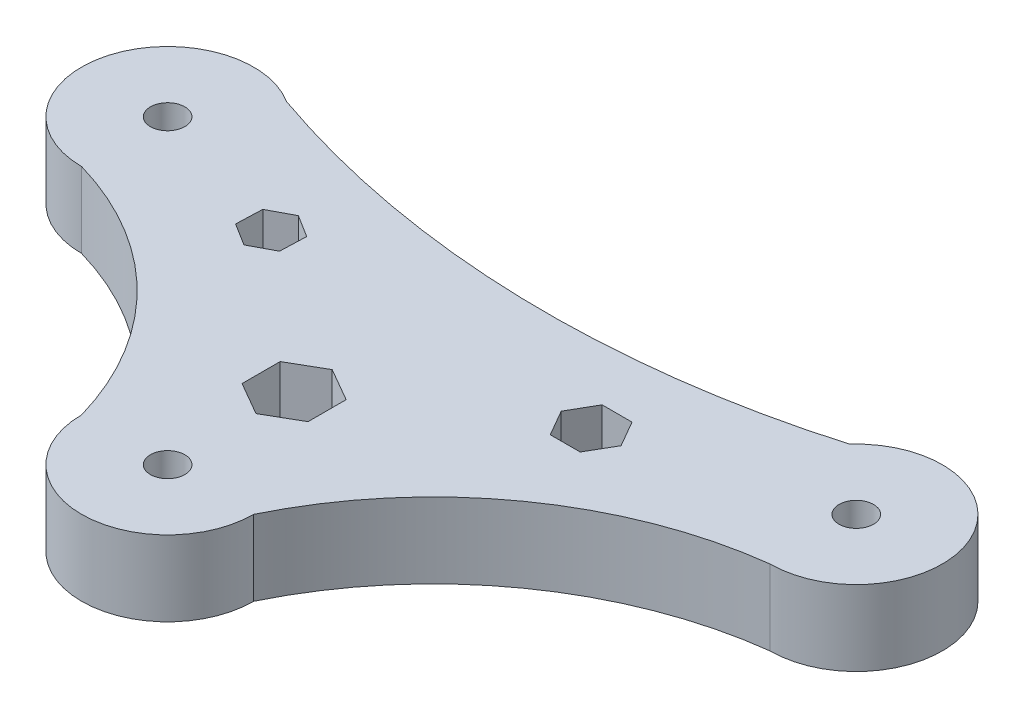
ISO-10303-21;
HEADER;
FILE_DESCRIPTION(('STEP AP214'),'2;1');
FILE_NAME('part.step','',(''),(''),'','','');
FILE_SCHEMA(('AUTOMOTIVE_DESIGN { 1 0 10303 214 1 1 1 1 }'));
ENDSEC;
DATA;
#1=APPLICATION_CONTEXT('core data for automotive mechanical design processes');
#2=APPLICATION_PROTOCOL_DEFINITION('international standard','automotive_design',2000,#1);
#3=PRODUCT_CONTEXT('',#1,'mechanical');
#4=PRODUCT('Part','Part','',(#3));
#5=PRODUCT_RELATED_PRODUCT_CATEGORY('part','',(#4));
#6=PRODUCT_DEFINITION_FORMATION('','',#4);
#7=PRODUCT_DEFINITION_CONTEXT('part definition',#1,'design');
#8=PRODUCT_DEFINITION('design','',#6,#7);
#9=PRODUCT_DEFINITION_SHAPE('','',#8);
#10=(LENGTH_UNIT() NAMED_UNIT(*) SI_UNIT(.MILLI.,.METRE.));
#11=(NAMED_UNIT(*) PLANE_ANGLE_UNIT() SI_UNIT($,.RADIAN.));
#12=(NAMED_UNIT(*) SI_UNIT($,.STERADIAN.) SOLID_ANGLE_UNIT());
#13=UNCERTAINTY_MEASURE_WITH_UNIT(LENGTH_MEASURE(1.E-05),#10,'distance_accuracy_value','');
#14=(GEOMETRIC_REPRESENTATION_CONTEXT(3) GLOBAL_UNCERTAINTY_ASSIGNED_CONTEXT((#13)) GLOBAL_UNIT_ASSIGNED_CONTEXT((#10,
#11,#12)) REPRESENTATION_CONTEXT('',''));
#15=CARTESIAN_POINT('',(0.,0.,0.));
#16=DIRECTION('',(0.,0.,1.));
#17=DIRECTION('',(1.,0.,0.));
#18=AXIS2_PLACEMENT_3D('',#15,#16,#17);
#19=CARTESIAN_POINT('',(5.36914479818591,7.,-117.947068273026));
#20=DIRECTION('',(0.,-1.,0.));
#21=DIRECTION('',(0.,0.,-1.));
#22=AXIS2_PLACEMENT_3D('',#19,#20,#21);
#23=CYLINDRICAL_SURFACE('',#22,88.131647090264);
#24=CARTESIAN_POINT('',(5.36914479818591,0.,-117.947068273026));
#25=DIRECTION('',(0.,1.,0.));
#26=DIRECTION('',(0.,0.,1.));
#27=AXIS2_PLACEMENT_3D('',#24,#25,#26);
#28=CIRCLE('',#27,88.131647090264);
#29=CARTESIAN_POINT('',(-23.7047539614299,0.,-34.7491378314677));
#30=VERTEX_POINT('',#29);
#31=CARTESIAN_POINT('',(30.0429345294128,0.,-33.3397912861026));
#32=VERTEX_POINT('',#31);
#33=EDGE_CURVE('E245',#30,#32,#28,.T.);
#34=ORIENTED_EDGE('',*,*,#33,.F.);
#35=DIRECTION('',(0.,-1.,0.));
#36=VECTOR('',#35,1.);
#37=CARTESIAN_POINT('',(-23.7047539614299,7.,-34.7491378314677));
#38=LINE('',#37,#36);
#39=CARTESIAN_POINT('',(-23.7047539614299,7.,-34.7491378314677));
#40=VERTEX_POINT('',#39);
#41=EDGE_CURVE('E11',#40,#30,#38,.T.);
#42=ORIENTED_EDGE('',*,*,#41,.F.);
#43=CARTESIAN_POINT('',(5.36914479818591,7.,-117.947068273026));
#44=DIRECTION('',(0.,1.,0.));
#45=DIRECTION('',(0.,0.,1.));
#46=AXIS2_PLACEMENT_3D('',#43,#44,#45);
#47=CIRCLE('',#46,88.131647090264);
#48=CARTESIAN_POINT('',(30.0429345294128,7.,-33.3397912861026));
#49=VERTEX_POINT('',#48);
#50=EDGE_CURVE('E346',#40,#49,#47,.T.);
#51=ORIENTED_EDGE('',*,*,#50,.T.);
#52=DIRECTION('',(0.,-1.,0.));
#53=VECTOR('',#52,1.);
#54=CARTESIAN_POINT('',(30.0429345294128,7.,-33.3397912861026));
#55=LINE('',#54,#53);
#56=EDGE_CURVE('E369',#49,#32,#55,.T.);
#57=ORIENTED_EDGE('',*,*,#56,.T.);
#58=EDGE_LOOP('',(#34,#42,#51,#57));
#59=FACE_BOUND('',#58,.T.);
#60=ADVANCED_FACE('F37',(#59),#23,.F.);
#61=CARTESIAN_POINT('',(-28.,7.,-28.));
#62=DIRECTION('',(0.,-1.,0.));
#63=DIRECTION('',(0.,0.,-1.));
#64=AXIS2_PLACEMENT_3D('',#61,#62,#63);
#65=CYLINDRICAL_SURFACE('',#64,8.);
#66=CARTESIAN_POINT('',(-28.,0.,-28.));
#67=DIRECTION('',(0.,1.,0.));
#68=DIRECTION('',(0.,0.,1.));
#69=AXIS2_PLACEMENT_3D('',#66,#67,#68);
#70=CIRCLE('',#69,8.);
#71=CARTESIAN_POINT('',(-28.,0.,-20.));
#72=VERTEX_POINT('',#71);
#73=EDGE_CURVE('E372',#30,#72,#70,.T.);
#74=ORIENTED_EDGE('',*,*,#73,.T.);
#75=DIRECTION('',(0.,-1.,0.));
#76=VECTOR('',#75,1.);
#77=CARTESIAN_POINT('',(-28.,7.,-20.));
#78=LINE('',#77,#76);
#79=CARTESIAN_POINT('',(-28.,7.,-20.));
#80=VERTEX_POINT('',#79);
#81=EDGE_CURVE('E44',#80,#72,#78,.T.);
#82=ORIENTED_EDGE('',*,*,#81,.F.);
#83=CARTESIAN_POINT('',(-28.,7.,-28.));
#84=DIRECTION('',(0.,1.,0.));
#85=DIRECTION('',(0.,0.,1.));
#86=AXIS2_PLACEMENT_3D('',#83,#84,#85);
#87=CIRCLE('',#86,8.);
#88=EDGE_CURVE('E349',#40,#80,#87,.T.);
#89=ORIENTED_EDGE('',*,*,#88,.F.);
#90=ORIENTED_EDGE('',*,*,#41,.T.);
#91=EDGE_LOOP('',(#74,#82,#89,#90));
#92=FACE_BOUND('',#91,.T.);
#93=ADVANCED_FACE('F430',(#92),#65,.T.);
#94=CARTESIAN_POINT('',(-36.0584719302514,7.,8.06085834931287));
#95=DIRECTION('',(0.,-1.,0.));
#96=DIRECTION('',(0.,0.,-1.));
#97=AXIS2_PLACEMENT_3D('',#94,#95,#96);
#98=CYLINDRICAL_SURFACE('',#97,29.1950465173606);
#99=CARTESIAN_POINT('',(-36.0584719302514,0.,8.06085834931287));
#100=DIRECTION('',(0.,1.,0.));
#101=DIRECTION('',(0.,0.,1.));
#102=AXIS2_PLACEMENT_3D('',#99,#100,#101);
#103=CIRCLE('',#102,29.1950465173606);
#104=CARTESIAN_POINT('',(-7.99999781608059,0.,-0.00591123554924541));
#105=VERTEX_POINT('',#104);
#106=EDGE_CURVE('E374',#72,#105,#103,.F.);
#107=ORIENTED_EDGE('',*,*,#106,.T.);
#108=DIRECTION('',(0.,-1.,0.));
#109=VECTOR('',#108,1.);
#110=CARTESIAN_POINT('',(-7.99999781608059,7.,-0.00591123554924541));
#111=LINE('',#110,#109);
#112=CARTESIAN_POINT('',(-7.99999781608059,7.,-0.00591123554924541));
#113=VERTEX_POINT('',#112);
#114=EDGE_CURVE('E398',#113,#105,#111,.T.);
#115=ORIENTED_EDGE('',*,*,#114,.F.);
#116=CARTESIAN_POINT('',(-36.0584719302514,7.,8.06085834931287));
#117=DIRECTION('',(0.,1.,0.));
#118=DIRECTION('',(0.,0.,1.));
#119=AXIS2_PLACEMENT_3D('',#116,#117,#118);
#120=CIRCLE('',#119,29.1950465173606);
#121=EDGE_CURVE('E352',#80,#113,#120,.F.);
#122=ORIENTED_EDGE('',*,*,#121,.F.);
#123=ORIENTED_EDGE('',*,*,#81,.T.);
#124=EDGE_LOOP('',(#107,#115,#122,#123));
#125=FACE_BOUND('',#124,.T.);
#126=ADVANCED_FACE('F405',(#125),#98,.F.);
#127=CARTESIAN_POINT('',(0.,7.,0.));
#128=DIRECTION('',(0.,-1.,0.));
#129=DIRECTION('',(0.,0.,-1.));
#130=AXIS2_PLACEMENT_3D('',#127,#128,#129);
#131=CYLINDRICAL_SURFACE('',#130,8.);
#132=CARTESIAN_POINT('',(0.,0.,0.));
#133=DIRECTION('',(0.,1.,0.));
#134=DIRECTION('',(0.,0.,1.));
#135=AXIS2_PLACEMENT_3D('',#132,#133,#134);
#136=CIRCLE('',#135,8.);
#137=CARTESIAN_POINT('',(8.,0.,0.));
#138=VERTEX_POINT('',#137);
#139=EDGE_CURVE('E376',#105,#138,#136,.T.);
#140=ORIENTED_EDGE('',*,*,#139,.T.);
#141=DIRECTION('',(0.,-1.,0.));
#142=VECTOR('',#141,1.);
#143=CARTESIAN_POINT('',(8.,7.,0.));
#144=LINE('',#143,#142);
#145=CARTESIAN_POINT('',(8.,7.,0.));
#146=VERTEX_POINT('',#145);
#147=EDGE_CURVE('E395',#146,#138,#144,.T.);
#148=ORIENTED_EDGE('',*,*,#147,.F.);
#149=CARTESIAN_POINT('',(0.,7.,0.));
#150=DIRECTION('',(0.,1.,0.));
#151=DIRECTION('',(0.,0.,1.));
#152=AXIS2_PLACEMENT_3D('',#149,#150,#151);
#153=CIRCLE('',#152,8.);
#154=EDGE_CURVE('E354',#113,#146,#153,.T.);
#155=ORIENTED_EDGE('',*,*,#154,.F.);
#156=ORIENTED_EDGE('',*,*,#114,.T.);
#157=EDGE_LOOP('',(#140,#148,#155,#156));
#158=FACE_BOUND('',#157,.T.);
#159=ADVANCED_FACE('F418',(#158),#131,.T.);
#160=CARTESIAN_POINT('',(40.3480725946694,7.,15.6873016325372));
#161=DIRECTION('',(0.,-1.,0.));
#162=DIRECTION('',(0.,0.,-1.));
#163=AXIS2_PLACEMENT_3D('',#160,#161,#162);
#164=CYLINDRICAL_SURFACE('',#163,35.9512062815729);
#165=CARTESIAN_POINT('',(40.3480725946694,0.,15.6873016325372));
#166=DIRECTION('',(0.,1.,0.));
#167=DIRECTION('',(0.,0.,1.));
#168=AXIS2_PLACEMENT_3D('',#165,#166,#167);
#169=CIRCLE('',#168,35.9512062815729);
#170=CARTESIAN_POINT('',(36.,0.,-20.));
#171=VERTEX_POINT('',#170);
#172=EDGE_CURVE('E378',#138,#171,#169,.F.);
#173=ORIENTED_EDGE('',*,*,#172,.T.);
#174=DIRECTION('',(0.,-1.,0.));
#175=VECTOR('',#174,1.);
#176=CARTESIAN_POINT('',(36.,7.,-20.));
#177=LINE('',#176,#175);
#178=CARTESIAN_POINT('',(36.,7.,-20.));
#179=VERTEX_POINT('',#178);
#180=EDGE_CURVE('E392',#179,#171,#177,.T.);
#181=ORIENTED_EDGE('',*,*,#180,.F.);
#182=CARTESIAN_POINT('',(40.3480725946694,7.,15.6873016325372));
#183=DIRECTION('',(0.,1.,0.));
#184=DIRECTION('',(0.,0.,1.));
#185=AXIS2_PLACEMENT_3D('',#182,#183,#184);
#186=CIRCLE('',#185,35.9512062815729);
#187=EDGE_CURVE('E356',#146,#179,#186,.F.);
#188=ORIENTED_EDGE('',*,*,#187,.F.);
#189=ORIENTED_EDGE('',*,*,#147,.T.);
#190=EDGE_LOOP('',(#173,#181,#188,#189));
#191=FACE_BOUND('',#190,.T.);
#192=ADVANCED_FACE('F422',(#191),#164,.F.);
#193=CARTESIAN_POINT('',(0.,7.,0.));
#194=DIRECTION('',(0.,-1.,0.));
#195=DIRECTION('',(0.,0.,-1.));
#196=AXIS2_PLACEMENT_3D('',#193,#194,#195);
#197=CYLINDRICAL_SURFACE('',#196,1.6);
#198=CARTESIAN_POINT('',(0.,7.,0.));
#199=DIRECTION('',(0.,1.,0.));
#200=DIRECTION('',(0.,0.,1.));
#201=AXIS2_PLACEMENT_3D('',#198,#199,#200);
#202=CIRCLE('',#201,1.6);
#203=CARTESIAN_POINT('',(0.,7.,1.6));
#204=VERTEX_POINT('',#203);
#205=EDGE_CURVE('E363',#204,#204,#202,.T.);
#206=ORIENTED_EDGE('',*,*,#205,.T.);
#207=EDGE_LOOP('',(#206));
#208=FACE_BOUND('',#207,.T.);
#209=CARTESIAN_POINT('',(0.,0.,0.));
#210=DIRECTION('',(0.,1.,0.));
#211=DIRECTION('',(0.,0.,1.));
#212=AXIS2_PLACEMENT_3D('',#209,#210,#211);
#213=CIRCLE('',#212,1.6);
#214=CARTESIAN_POINT('',(0.,0.,1.6));
#215=VERTEX_POINT('',#214);
#216=EDGE_CURVE('E386',#215,#215,#213,.T.);
#217=ORIENTED_EDGE('',*,*,#216,.F.);
#218=EDGE_LOOP('',(#217));
#219=FACE_BOUND('',#218,.T.);
#220=ADVANCED_FACE('F444',(#208,#219),#197,.F.);
#221=CARTESIAN_POINT('',(36.,7.,-28.));
#222=DIRECTION('',(0.,-1.,0.));
#223=DIRECTION('',(0.,0.,-1.));
#224=AXIS2_PLACEMENT_3D('',#221,#222,#223);
#225=CYLINDRICAL_SURFACE('',#224,1.6);
#226=CARTESIAN_POINT('',(36.,7.,-28.));
#227=DIRECTION('',(0.,1.,0.));
#228=DIRECTION('',(0.,0.,1.));
#229=AXIS2_PLACEMENT_3D('',#226,#227,#228);
#230=CIRCLE('',#229,1.6);
#231=CARTESIAN_POINT('',(36.,7.,-26.4));
#232=VERTEX_POINT('',#231);
#233=EDGE_CURVE('E360',#232,#232,#230,.T.);
#234=ORIENTED_EDGE('',*,*,#233,.T.);
#235=EDGE_LOOP('',(#234));
#236=FACE_BOUND('',#235,.T.);
#237=CARTESIAN_POINT('',(36.,0.,-28.));
#238=DIRECTION('',(0.,1.,0.));
#239=DIRECTION('',(0.,0.,1.));
#240=AXIS2_PLACEMENT_3D('',#237,#238,#239);
#241=CIRCLE('',#240,1.6);
#242=CARTESIAN_POINT('',(36.,0.,-26.4));
#243=VERTEX_POINT('',#242);
#244=EDGE_CURVE('E383',#243,#243,#241,.T.);
#245=ORIENTED_EDGE('',*,*,#244,.F.);
#246=EDGE_LOOP('',(#245));
#247=FACE_BOUND('',#246,.T.);
#248=ADVANCED_FACE('F436',(#236,#247),#225,.F.);
#249=CARTESIAN_POINT('',(36.,7.,-28.));
#250=DIRECTION('',(0.,-1.,0.));
#251=DIRECTION('',(0.,0.,-1.));
#252=AXIS2_PLACEMENT_3D('',#249,#250,#251);
#253=CYLINDRICAL_SURFACE('',#252,8.00000000000001);
#254=CARTESIAN_POINT('',(36.,0.,-28.));
#255=DIRECTION('',(0.,1.,0.));
#256=DIRECTION('',(0.,0.,1.));
#257=AXIS2_PLACEMENT_3D('',#254,#255,#256);
#258=CIRCLE('',#257,8.00000000000001);
#259=EDGE_CURVE('E380',#171,#32,#258,.T.);
#260=ORIENTED_EDGE('',*,*,#259,.T.);
#261=ORIENTED_EDGE('',*,*,#56,.F.);
#262=CARTESIAN_POINT('',(36.,7.,-28.));
#263=DIRECTION('',(0.,1.,0.));
#264=DIRECTION('',(0.,0.,1.));
#265=AXIS2_PLACEMENT_3D('',#262,#263,#264);
#266=CIRCLE('',#265,8.00000000000001);
#267=EDGE_CURVE('E358',#179,#49,#266,.T.);
#268=ORIENTED_EDGE('',*,*,#267,.F.);
#269=ORIENTED_EDGE('',*,*,#180,.T.);
#270=EDGE_LOOP('',(#260,#261,#268,#269));
#271=FACE_BOUND('',#270,.T.);
#272=ADVANCED_FACE('F433',(#271),#253,.T.);
#273=CARTESIAN_POINT('',(-28.,7.,-28.));
#274=DIRECTION('',(0.,-1.,0.));
#275=DIRECTION('',(0.,0.,-1.));
#276=AXIS2_PLACEMENT_3D('',#273,#274,#275);
#277=CYLINDRICAL_SURFACE('',#276,1.60000000000001);
#278=CARTESIAN_POINT('',(-28.,7.,-28.));
#279=DIRECTION('',(0.,1.,0.));
#280=DIRECTION('',(0.,0.,1.));
#281=AXIS2_PLACEMENT_3D('',#278,#279,#280);
#282=CIRCLE('',#281,1.60000000000001);
#283=CARTESIAN_POINT('',(-28.,7.,-26.4));
#284=VERTEX_POINT('',#283);
#285=EDGE_CURVE('E366',#284,#284,#282,.T.);
#286=ORIENTED_EDGE('',*,*,#285,.T.);
#287=EDGE_LOOP('',(#286));
#288=FACE_BOUND('',#287,.T.);
#289=CARTESIAN_POINT('',(-28.,0.,-28.));
#290=DIRECTION('',(0.,1.,0.));
#291=DIRECTION('',(0.,0.,1.));
#292=AXIS2_PLACEMENT_3D('',#289,#290,#291);
#293=CIRCLE('',#292,1.60000000000001);
#294=CARTESIAN_POINT('',(-28.,0.,-26.4));
#295=VERTEX_POINT('',#294);
#296=EDGE_CURVE('E350',#295,#295,#293,.T.);
#297=ORIENTED_EDGE('',*,*,#296,.F.);
#298=EDGE_LOOP('',(#297));
#299=FACE_BOUND('',#298,.T.);
#300=ADVANCED_FACE('F435',(#288,#299),#277,.F.);
#301=CARTESIAN_POINT('',(0.,7.,0.));
#302=DIRECTION('',(0.,1.,0.));
#303=DIRECTION('',(0.,0.,1.));
#304=AXIS2_PLACEMENT_3D('',#301,#302,#303);
#305=PLANE('',#304);
#306=DIRECTION('',(0.882991698024119,0.,-0.469388603632943));
#307=VECTOR('',#306,1.);
#308=CARTESIAN_POINT('',(-14.1373284679445,7.,-21.2306813493957));
#309=LINE('',#308,#307);
#310=CARTESIAN_POINT('',(-14.1373284679445,7.,-21.2306813493957));
#311=VERTEX_POINT('',#310);
#312=CARTESIAN_POINT('',(-11.9788546012623,7.,-22.3781021422835));
#313=VERTEX_POINT('',#312);
#314=EDGE_CURVE('E51',#311,#313,#309,.T.);
#315=ORIENTED_EDGE('',*,*,#314,.F.);
#316=DIRECTION('',(0.847998304005092,0.,0.529998940003173));
#317=VECTOR('',#316,1.);
#318=CARTESIAN_POINT('',(-16.2102609567569,7.,-22.5262641549035));
#319=LINE('',#318,#317);
#320=CARTESIAN_POINT('',(-16.2102609567569,7.,-22.5262641549035));
#321=VERTEX_POINT('',#320);
#322=EDGE_CURVE('E218',#321,#311,#319,.T.);
#323=ORIENTED_EDGE('',*,*,#322,.F.);
#324=DIRECTION('',(-0.0349933940190266,0.,0.999387543636116));
#325=VECTOR('',#324,1.);
#326=CARTESIAN_POINT('',(-16.1247195788871,7.,-24.969267753299));
#327=LINE('',#326,#325);
#328=CARTESIAN_POINT('',(-16.1247195788871,7.,-24.969267753299));
#329=VERTEX_POINT('',#328);
#330=EDGE_CURVE('E221',#329,#321,#327,.T.);
#331=ORIENTED_EDGE('',*,*,#330,.F.);
#332=DIRECTION('',(-0.882991698024119,0.,0.469388603632942));
#333=VECTOR('',#332,1.);
#334=CARTESIAN_POINT('',(-13.9662457122049,7.,-26.1166885461868));
#335=LINE('',#334,#333);
#336=CARTESIAN_POINT('',(-13.9662457122049,7.,-26.1166885461868));
#337=VERTEX_POINT('',#336);
#338=EDGE_CURVE('E238',#337,#329,#335,.T.);
#339=ORIENTED_EDGE('',*,*,#338,.F.);
#340=DIRECTION('',(-0.847998304005092,0.,-0.529998940003174));
#341=VECTOR('',#340,1.);
#342=CARTESIAN_POINT('',(-11.8933132233925,7.,-24.821105740679));
#343=LINE('',#342,#341);
#344=CARTESIAN_POINT('',(-11.8933132233925,7.,-24.821105740679));
#345=VERTEX_POINT('',#344);
#346=EDGE_CURVE('E235',#345,#337,#343,.T.);
#347=ORIENTED_EDGE('',*,*,#346,.F.);
#348=DIRECTION('',(0.0349933940190267,0.,-0.999387543636116));
#349=VECTOR('',#348,1.);
#350=CARTESIAN_POINT('',(-11.9788546012623,7.,-22.3781021422835));
#351=LINE('',#350,#349);
#352=EDGE_CURVE('E232',#313,#345,#351,.T.);
#353=ORIENTED_EDGE('',*,*,#352,.F.);
#354=EDGE_LOOP('',(#315,#323,#331,#339,#347,#353));
#355=FACE_BOUND('',#354,.T.);
#356=DIRECTION('',(0.499999999999995,0.,-0.866025403784442));
#357=VECTOR('',#356,1.);
#358=CARTESIAN_POINT('',(18.156731560819,7.,-20.1865840519463));
#359=LINE('',#358,#357);
#360=CARTESIAN_POINT('',(18.156731560819,7.,-20.1865840519463));
#361=VERTEX_POINT('',#360);
#362=CARTESIAN_POINT('',(19.546993666093,7.,-22.5945886541186));
#363=VERTEX_POINT('',#362);
#364=EDGE_CURVE('E59',#361,#363,#359,.T.);
#365=ORIENTED_EDGE('',*,*,#364,.F.);
#366=DIRECTION('',(1.,0.,0.));
#367=VECTOR('',#366,1.);
#368=CARTESIAN_POINT('',(15.3762073502708,7.,-20.1865840519463));
#369=LINE('',#368,#367);
#370=CARTESIAN_POINT('',(15.3762073502708,7.,-20.1865840519463));
#371=VERTEX_POINT('',#370);
#372=EDGE_CURVE('E257',#371,#361,#369,.T.);
#373=ORIENTED_EDGE('',*,*,#372,.F.);
#374=DIRECTION('',(0.500000000000007,0.,0.866025403784434));
#375=VECTOR('',#374,1.);
#376=CARTESIAN_POINT('',(13.9859452449967,7.,-22.5945886541186));
#377=LINE('',#376,#375);
#378=CARTESIAN_POINT('',(13.9859452449967,7.,-22.5945886541186));
#379=VERTEX_POINT('',#378);
#380=EDGE_CURVE('E284',#379,#371,#377,.T.);
#381=ORIENTED_EDGE('',*,*,#380,.F.);
#382=DIRECTION('',(-0.499999999999995,0.,0.866025403784442));
#383=VECTOR('',#382,1.);
#384=CARTESIAN_POINT('',(15.3762073502708,7.,-25.002593256291));
#385=LINE('',#384,#383);
#386=CARTESIAN_POINT('',(15.3762073502708,7.,-25.002593256291));
#387=VERTEX_POINT('',#386);
#388=EDGE_CURVE('E281',#387,#379,#385,.T.);
#389=ORIENTED_EDGE('',*,*,#388,.F.);
#390=DIRECTION('',(-1.,0.,0.));
#391=VECTOR('',#390,1.);
#392=CARTESIAN_POINT('',(18.1567315608189,7.,-25.002593256291));
#393=LINE('',#392,#391);
#394=CARTESIAN_POINT('',(18.1567315608189,7.,-25.002593256291));
#395=VERTEX_POINT('',#394);
#396=EDGE_CURVE('E278',#395,#387,#393,.T.);
#397=ORIENTED_EDGE('',*,*,#396,.F.);
#398=DIRECTION('',(-0.500000000000002,0.,-0.866025403784438));
#399=VECTOR('',#398,1.);
#400=CARTESIAN_POINT('',(19.546993666093,7.,-22.5945886541186));
#401=LINE('',#400,#399);
#402=EDGE_CURVE('E274',#363,#395,#401,.T.);
#403=ORIENTED_EDGE('',*,*,#402,.F.);
#404=EDGE_LOOP('',(#365,#373,#381,#389,#397,#403));
#405=FACE_BOUND('',#404,.T.);
#406=DIRECTION('',(0.866025403784442,0.,0.499999999999995));
#407=VECTOR('',#406,1.);
#408=CARTESIAN_POINT('',(-3.06682083422112,7.,-9.98369330292597));
#409=LINE('',#408,#407);
#410=CARTESIAN_POINT('',(-3.06682083422112,7.,-9.98369330292597));
#411=VERTEX_POINT('',#410);
#412=CARTESIAN_POINT('',(0.,7.,-8.21306346873208));
#413=VERTEX_POINT('',#412);
#414=EDGE_CURVE('E319',#411,#413,#409,.T.);
#415=ORIENTED_EDGE('',*,*,#414,.F.);
#416=DIRECTION('',(0.,0.,1.));
#417=VECTOR('',#416,1.);
#418=CARTESIAN_POINT('',(-3.06682083422116,7.,-13.5249529713138));
#419=LINE('',#418,#417);
#420=CARTESIAN_POINT('',(-3.06682083422116,7.,-13.5249529713138));
#421=VERTEX_POINT('',#420);
#422=EDGE_CURVE('E303',#421,#411,#419,.T.);
#423=ORIENTED_EDGE('',*,*,#422,.F.);
#424=DIRECTION('',(-0.866025403784435,0.,0.500000000000007));
#425=VECTOR('',#424,1.);
#426=CARTESIAN_POINT('',(0.,7.,-15.2955828055078));
#427=LINE('',#426,#425);
#428=CARTESIAN_POINT('',(0.,7.,-15.2955828055078));
#429=VERTEX_POINT('',#428);
#430=EDGE_CURVE('E330',#429,#421,#427,.T.);
#431=ORIENTED_EDGE('',*,*,#430,.F.);
#432=DIRECTION('',(-0.866025403784442,0.,-0.499999999999995));
#433=VECTOR('',#432,1.);
#434=CARTESIAN_POINT('',(3.06682083422113,7.,-13.5249529713139));
#435=LINE('',#434,#433);
#436=CARTESIAN_POINT('',(3.06682083422113,7.,-13.5249529713139));
#437=VERTEX_POINT('',#436);
#438=EDGE_CURVE('E327',#437,#429,#435,.T.);
#439=ORIENTED_EDGE('',*,*,#438,.F.);
#440=DIRECTION('',(0.,0.,-1.));
#441=VECTOR('',#440,1.);
#442=CARTESIAN_POINT('',(3.06682083422115,7.,-9.98369330292601));
#443=LINE('',#442,#441);
#444=CARTESIAN_POINT('',(3.06682083422115,7.,-9.98369330292601));
#445=VERTEX_POINT('',#444);
#446=EDGE_CURVE('E324',#445,#437,#443,.T.);
#447=ORIENTED_EDGE('',*,*,#446,.F.);
#448=DIRECTION('',(0.866025403784438,0.,-0.500000000000001));
#449=VECTOR('',#448,1.);
#450=CARTESIAN_POINT('',(0.,7.,-8.21306346873208));
#451=LINE('',#450,#449);
#452=EDGE_CURVE('E321',#413,#445,#451,.T.);
#453=ORIENTED_EDGE('',*,*,#452,.F.);
#454=EDGE_LOOP('',(#415,#423,#431,#439,#447,#453));
#455=FACE_BOUND('',#454,.T.);
#456=ORIENTED_EDGE('',*,*,#50,.F.);
#457=ORIENTED_EDGE('',*,*,#88,.T.);
#458=ORIENTED_EDGE('',*,*,#121,.T.);
#459=ORIENTED_EDGE('',*,*,#154,.T.);
#460=ORIENTED_EDGE('',*,*,#187,.T.);
#461=ORIENTED_EDGE('',*,*,#267,.T.);
#462=EDGE_LOOP('',(#456,#457,#458,#459,#460,#461));
#463=FACE_BOUND('',#462,.T.);
#464=ORIENTED_EDGE('',*,*,#233,.F.);
#465=EDGE_LOOP('',(#464));
#466=FACE_BOUND('',#465,.T.);
#467=ORIENTED_EDGE('',*,*,#205,.F.);
#468=EDGE_LOOP('',(#467));
#469=FACE_BOUND('',#468,.T.);
#470=ORIENTED_EDGE('',*,*,#285,.F.);
#471=EDGE_LOOP('',(#470));
#472=FACE_BOUND('',#471,.T.);
#473=ADVANCED_FACE('F427',(#355,#405,#455,#463,#466,#469,#472),#305,.T.);
#474=CARTESIAN_POINT('',(0.,0.,0.));
#475=DIRECTION('',(0.,1.,0.));
#476=DIRECTION('',(0.,0.,1.));
#477=AXIS2_PLACEMENT_3D('',#474,#475,#476);
#478=PLANE('',#477);
#479=DIRECTION('',(0.847998304005092,0.,0.529998940003173));
#480=VECTOR('',#479,1.);
#481=CARTESIAN_POINT('',(-16.2102609567569,0.,-22.5262641549035));
#482=LINE('',#481,#480);
#483=CARTESIAN_POINT('',(-16.2102609567569,0.,-22.5262641549035));
#484=VERTEX_POINT('',#483);
#485=CARTESIAN_POINT('',(-14.1373284679445,0.,-21.2306813493957));
#486=VERTEX_POINT('',#485);
#487=EDGE_CURVE('E204',#484,#486,#482,.T.);
#488=ORIENTED_EDGE('',*,*,#487,.T.);
#489=DIRECTION('',(0.882991698024119,0.,-0.469388603632943));
#490=VECTOR('',#489,1.);
#491=CARTESIAN_POINT('',(-14.1373284679445,0.,-21.2306813493957));
#492=LINE('',#491,#490);
#493=CARTESIAN_POINT('',(-11.9788546012623,0.,-22.3781021422835));
#494=VERTEX_POINT('',#493);
#495=EDGE_CURVE('E198',#486,#494,#492,.T.);
#496=ORIENTED_EDGE('',*,*,#495,.T.);
#497=DIRECTION('',(0.0349933940190267,0.,-0.999387543636116));
#498=VECTOR('',#497,1.);
#499=CARTESIAN_POINT('',(-11.9788546012623,0.,-22.3781021422835));
#500=LINE('',#499,#498);
#501=CARTESIAN_POINT('',(-11.8933132233925,0.,-24.821105740679));
#502=VERTEX_POINT('',#501);
#503=EDGE_CURVE('E208',#494,#502,#500,.T.);
#504=ORIENTED_EDGE('',*,*,#503,.T.);
#505=DIRECTION('',(-0.847998304005092,0.,-0.529998940003174));
#506=VECTOR('',#505,1.);
#507=CARTESIAN_POINT('',(-11.8933132233925,0.,-24.821105740679));
#508=LINE('',#507,#506);
#509=CARTESIAN_POINT('',(-13.9662457122049,0.,-26.1166885461868));
#510=VERTEX_POINT('',#509);
#511=EDGE_CURVE('E212',#502,#510,#508,.T.);
#512=ORIENTED_EDGE('',*,*,#511,.T.);
#513=DIRECTION('',(-0.882991698024119,0.,0.469388603632942));
#514=VECTOR('',#513,1.);
#515=CARTESIAN_POINT('',(-13.9662457122049,0.,-26.1166885461868));
#516=LINE('',#515,#514);
#517=CARTESIAN_POINT('',(-16.1247195788871,0.,-24.969267753299));
#518=VERTEX_POINT('',#517);
#519=EDGE_CURVE('E225',#510,#518,#516,.T.);
#520=ORIENTED_EDGE('',*,*,#519,.T.);
#521=DIRECTION('',(-0.0349933940190266,0.,0.999387543636116));
#522=VECTOR('',#521,1.);
#523=CARTESIAN_POINT('',(-16.1247195788871,0.,-24.969267753299));
#524=LINE('',#523,#522);
#525=EDGE_CURVE('E228',#518,#484,#524,.T.);
#526=ORIENTED_EDGE('',*,*,#525,.T.);
#527=EDGE_LOOP('',(#488,#496,#504,#512,#520,#526));
#528=FACE_BOUND('',#527,.T.);
#529=DIRECTION('',(1.,0.,0.));
#530=VECTOR('',#529,1.);
#531=CARTESIAN_POINT('',(15.3762073502708,0.,-20.1865840519463));
#532=LINE('',#531,#530);
#533=CARTESIAN_POINT('',(15.3762073502708,0.,-20.1865840519463));
#534=VERTEX_POINT('',#533);
#535=CARTESIAN_POINT('',(18.156731560819,0.,-20.1865840519463));
#536=VERTEX_POINT('',#535);
#537=EDGE_CURVE('E269',#534,#536,#532,.T.);
#538=ORIENTED_EDGE('',*,*,#537,.T.);
#539=DIRECTION('',(0.499999999999995,0.,-0.866025403784442));
#540=VECTOR('',#539,1.);
#541=CARTESIAN_POINT('',(18.156731560819,0.,-20.1865840519463));
#542=LINE('',#541,#540);
#543=CARTESIAN_POINT('',(19.546993666093,0.,-22.5945886541186));
#544=VERTEX_POINT('',#543);
#545=EDGE_CURVE('E253',#536,#544,#542,.T.);
#546=ORIENTED_EDGE('',*,*,#545,.T.);
#547=DIRECTION('',(-0.500000000000002,0.,-0.866025403784438));
#548=VECTOR('',#547,1.);
#549=CARTESIAN_POINT('',(19.546993666093,0.,-22.5945886541186));
#550=LINE('',#549,#548);
#551=CARTESIAN_POINT('',(18.1567315608189,0.,-25.002593256291));
#552=VERTEX_POINT('',#551);
#553=EDGE_CURVE('E256',#544,#552,#550,.T.);
#554=ORIENTED_EDGE('',*,*,#553,.T.);
#555=DIRECTION('',(-1.,0.,0.));
#556=VECTOR('',#555,1.);
#557=CARTESIAN_POINT('',(18.1567315608189,0.,-25.002593256291));
#558=LINE('',#557,#556);
#559=CARTESIAN_POINT('',(15.3762073502708,0.,-25.002593256291));
#560=VERTEX_POINT('',#559);
#561=EDGE_CURVE('E260',#552,#560,#558,.T.);
#562=ORIENTED_EDGE('',*,*,#561,.T.);
#563=DIRECTION('',(-0.499999999999995,0.,0.866025403784442));
#564=VECTOR('',#563,1.);
#565=CARTESIAN_POINT('',(15.3762073502708,0.,-25.002593256291));
#566=LINE('',#565,#564);
#567=CARTESIAN_POINT('',(13.9859452449967,0.,-22.5945886541186));
#568=VERTEX_POINT('',#567);
#569=EDGE_CURVE('E263',#560,#568,#566,.T.);
#570=ORIENTED_EDGE('',*,*,#569,.T.);
#571=DIRECTION('',(0.500000000000007,0.,0.866025403784434));
#572=VECTOR('',#571,1.);
#573=CARTESIAN_POINT('',(13.9859452449967,0.,-22.5945886541186));
#574=LINE('',#573,#572);
#575=EDGE_CURVE('E266',#568,#534,#574,.T.);
#576=ORIENTED_EDGE('',*,*,#575,.T.);
#577=EDGE_LOOP('',(#538,#546,#554,#562,#570,#576));
#578=FACE_BOUND('',#577,.T.);
#579=DIRECTION('',(0.,0.,1.));
#580=VECTOR('',#579,1.);
#581=CARTESIAN_POINT('',(-3.06682083422116,0.,-13.5249529713138));
#582=LINE('',#581,#580);
#583=CARTESIAN_POINT('',(-3.06682083422116,0.,-13.5249529713138));
#584=VERTEX_POINT('',#583);
#585=CARTESIAN_POINT('',(-3.06682083422112,0.,-9.98369330292597));
#586=VERTEX_POINT('',#585);
#587=EDGE_CURVE('E315',#584,#586,#582,.T.);
#588=ORIENTED_EDGE('',*,*,#587,.T.);
#589=DIRECTION('',(0.866025403784442,0.,0.499999999999995));
#590=VECTOR('',#589,1.);
#591=CARTESIAN_POINT('',(-3.06682083422112,0.,-9.98369330292597));
#592=LINE('',#591,#590);
#593=CARTESIAN_POINT('',(0.,0.,-8.21306346873208));
#594=VERTEX_POINT('',#593);
#595=EDGE_CURVE('E299',#586,#594,#592,.T.);
#596=ORIENTED_EDGE('',*,*,#595,.T.);
#597=DIRECTION('',(0.866025403784438,0.,-0.500000000000001));
#598=VECTOR('',#597,1.);
#599=CARTESIAN_POINT('',(0.,0.,-8.21306346873208));
#600=LINE('',#599,#598);
#601=CARTESIAN_POINT('',(3.06682083422115,0.,-9.98369330292601));
#602=VERTEX_POINT('',#601);
#603=EDGE_CURVE('E302',#594,#602,#600,.T.);
#604=ORIENTED_EDGE('',*,*,#603,.T.);
#605=DIRECTION('',(0.,0.,-1.));
#606=VECTOR('',#605,1.);
#607=CARTESIAN_POINT('',(3.06682083422115,0.,-9.98369330292601));
#608=LINE('',#607,#606);
#609=CARTESIAN_POINT('',(3.06682083422113,0.,-13.5249529713139));
#610=VERTEX_POINT('',#609);
#611=EDGE_CURVE('E306',#602,#610,#608,.T.);
#612=ORIENTED_EDGE('',*,*,#611,.T.);
#613=DIRECTION('',(-0.866025403784442,0.,-0.499999999999995));
#614=VECTOR('',#613,1.);
#615=CARTESIAN_POINT('',(3.06682083422113,0.,-13.5249529713139));
#616=LINE('',#615,#614);
#617=CARTESIAN_POINT('',(0.,0.,-15.2955828055078));
#618=VERTEX_POINT('',#617);
#619=EDGE_CURVE('E309',#610,#618,#616,.T.);
#620=ORIENTED_EDGE('',*,*,#619,.T.);
#621=DIRECTION('',(-0.866025403784435,0.,0.500000000000007));
#622=VECTOR('',#621,1.);
#623=CARTESIAN_POINT('',(0.,0.,-15.2955828055078));
#624=LINE('',#623,#622);
#625=EDGE_CURVE('E312',#618,#584,#624,.T.);
#626=ORIENTED_EDGE('',*,*,#625,.T.);
#627=EDGE_LOOP('',(#588,#596,#604,#612,#620,#626));
#628=FACE_BOUND('',#627,.T.);
#629=ORIENTED_EDGE('',*,*,#33,.T.);
#630=ORIENTED_EDGE('',*,*,#259,.F.);
#631=ORIENTED_EDGE('',*,*,#172,.F.);
#632=ORIENTED_EDGE('',*,*,#139,.F.);
#633=ORIENTED_EDGE('',*,*,#106,.F.);
#634=ORIENTED_EDGE('',*,*,#73,.F.);
#635=EDGE_LOOP('',(#629,#630,#631,#632,#633,#634));
#636=FACE_BOUND('',#635,.T.);
#637=ORIENTED_EDGE('',*,*,#244,.T.);
#638=EDGE_LOOP('',(#637));
#639=FACE_BOUND('',#638,.T.);
#640=ORIENTED_EDGE('',*,*,#216,.T.);
#641=EDGE_LOOP('',(#640));
#642=FACE_BOUND('',#641,.T.);
#643=ORIENTED_EDGE('',*,*,#296,.T.);
#644=EDGE_LOOP('',(#643));
#645=FACE_BOUND('',#644,.T.);
#646=ADVANCED_FACE('F214',(#528,#578,#628,#636,#639,#642,#645),#478,.F.);
#647=CARTESIAN_POINT('',(-3.06682083422112,0.,-9.98369330292597));
#648=DIRECTION('',(-0.499999999999995,0.,0.866025403784442));
#649=DIRECTION('',(0.866025403784442,0.,0.499999999999995));
#650=AXIS2_PLACEMENT_3D('',#647,#648,#649);
#651=PLANE('',#650);
#652=ORIENTED_EDGE('',*,*,#414,.T.);
#653=DIRECTION('',(0.,1.,0.));
#654=VECTOR('',#653,1.);
#655=CARTESIAN_POINT('',(0.,0.,-8.21306346873208));
#656=LINE('',#655,#654);
#657=EDGE_CURVE('E318',#594,#413,#656,.T.);
#658=ORIENTED_EDGE('',*,*,#657,.F.);
#659=ORIENTED_EDGE('',*,*,#595,.F.);
#660=DIRECTION('',(0.,1.,0.));
#661=VECTOR('',#660,1.);
#662=CARTESIAN_POINT('',(-3.06682083422112,0.,-9.98369330292597));
#663=LINE('',#662,#661);
#664=EDGE_CURVE('E275',#586,#411,#663,.T.);
#665=ORIENTED_EDGE('',*,*,#664,.T.);
#666=EDGE_LOOP('',(#652,#658,#659,#665));
#667=FACE_BOUND('',#666,.T.);
#668=ADVANCED_FACE('F470',(#667),#651,.F.);
#669=CARTESIAN_POINT('',(-3.06682083422116,0.,-13.5249529713138));
#670=DIRECTION('',(-1.,0.,0.));
#671=DIRECTION('',(0.,0.,1.));
#672=AXIS2_PLACEMENT_3D('',#669,#670,#671);
#673=PLANE('',#672);
#674=ORIENTED_EDGE('',*,*,#422,.T.);
#675=ORIENTED_EDGE('',*,*,#664,.F.);
#676=ORIENTED_EDGE('',*,*,#587,.F.);
#677=DIRECTION('',(0.,1.,0.));
#678=VECTOR('',#677,1.);
#679=CARTESIAN_POINT('',(-3.06682083422116,0.,-13.5249529713138));
#680=LINE('',#679,#678);
#681=EDGE_CURVE('E336',#584,#421,#680,.T.);
#682=ORIENTED_EDGE('',*,*,#681,.T.);
#683=EDGE_LOOP('',(#674,#675,#676,#682));
#684=FACE_BOUND('',#683,.T.);
#685=ADVANCED_FACE('F476',(#684),#673,.F.);
#686=CARTESIAN_POINT('',(0.,0.,-15.2955828055078));
#687=DIRECTION('',(-0.500000000000007,0.,-0.866025403784435));
#688=DIRECTION('',(-0.866025403784435,0.,0.500000000000007));
#689=AXIS2_PLACEMENT_3D('',#686,#687,#688);
#690=PLANE('',#689);
#691=ORIENTED_EDGE('',*,*,#430,.T.);
#692=ORIENTED_EDGE('',*,*,#681,.F.);
#693=ORIENTED_EDGE('',*,*,#625,.F.);
#694=DIRECTION('',(0.,1.,0.));
#695=VECTOR('',#694,1.);
#696=CARTESIAN_POINT('',(0.,0.,-15.2955828055078));
#697=LINE('',#696,#695);
#698=EDGE_CURVE('E338',#618,#429,#697,.T.);
#699=ORIENTED_EDGE('',*,*,#698,.T.);
#700=EDGE_LOOP('',(#691,#692,#693,#699));
#701=FACE_BOUND('',#700,.T.);
#702=ADVANCED_FACE('F490',(#701),#690,.F.);
#703=CARTESIAN_POINT('',(3.06682083422113,0.,-13.5249529713139));
#704=DIRECTION('',(0.499999999999995,0.,-0.866025403784442));
#705=DIRECTION('',(-0.866025403784442,0.,-0.499999999999995));
#706=AXIS2_PLACEMENT_3D('',#703,#704,#705);
#707=PLANE('',#706);
#708=ORIENTED_EDGE('',*,*,#438,.T.);
#709=ORIENTED_EDGE('',*,*,#698,.F.);
#710=ORIENTED_EDGE('',*,*,#619,.F.);
#711=DIRECTION('',(0.,1.,0.));
#712=VECTOR('',#711,1.);
#713=CARTESIAN_POINT('',(3.06682083422113,0.,-13.5249529713139));
#714=LINE('',#713,#712);
#715=EDGE_CURVE('E340',#610,#437,#714,.T.);
#716=ORIENTED_EDGE('',*,*,#715,.T.);
#717=EDGE_LOOP('',(#708,#709,#710,#716));
#718=FACE_BOUND('',#717,.T.);
#719=ADVANCED_FACE('F486',(#718),#707,.F.);
#720=CARTESIAN_POINT('',(3.06682083422115,0.,-9.98369330292601));
#721=DIRECTION('',(1.,0.,0.));
#722=DIRECTION('',(0.,0.,-1.));
#723=AXIS2_PLACEMENT_3D('',#720,#721,#722);
#724=PLANE('',#723);
#725=ORIENTED_EDGE('',*,*,#446,.T.);
#726=ORIENTED_EDGE('',*,*,#715,.F.);
#727=ORIENTED_EDGE('',*,*,#611,.F.);
#728=DIRECTION('',(0.,1.,0.));
#729=VECTOR('',#728,1.);
#730=CARTESIAN_POINT('',(3.06682083422115,0.,-9.98369330292601));
#731=LINE('',#730,#729);
#732=EDGE_CURVE('E342',#602,#445,#731,.T.);
#733=ORIENTED_EDGE('',*,*,#732,.T.);
#734=EDGE_LOOP('',(#725,#726,#727,#733));
#735=FACE_BOUND('',#734,.T.);
#736=ADVANCED_FACE('F482',(#735),#724,.F.);
#737=CARTESIAN_POINT('',(0.,0.,-8.21306346873208));
#738=DIRECTION('',(0.500000000000001,0.,0.866025403784438));
#739=DIRECTION('',(0.866025403784438,0.,-0.500000000000001));
#740=AXIS2_PLACEMENT_3D('',#737,#738,#739);
#741=PLANE('',#740);
#742=ORIENTED_EDGE('',*,*,#452,.T.);
#743=ORIENTED_EDGE('',*,*,#732,.F.);
#744=ORIENTED_EDGE('',*,*,#603,.F.);
#745=ORIENTED_EDGE('',*,*,#657,.T.);
#746=EDGE_LOOP('',(#742,#743,#744,#745));
#747=FACE_BOUND('',#746,.T.);
#748=ADVANCED_FACE('F478',(#747),#741,.F.);
#749=CARTESIAN_POINT('',(18.156731560819,0.,-20.1865840519463));
#750=DIRECTION('',(0.866025403784442,0.,0.499999999999995));
#751=DIRECTION('',(0.499999999999995,0.,-0.866025403784442));
#752=AXIS2_PLACEMENT_3D('',#749,#750,#751);
#753=PLANE('',#752);
#754=ORIENTED_EDGE('',*,*,#364,.T.);
#755=DIRECTION('',(0.,1.,0.));
#756=VECTOR('',#755,1.);
#757=CARTESIAN_POINT('',(19.546993666093,0.,-22.5945886541186));
#758=LINE('',#757,#756);
#759=EDGE_CURVE('E272',#544,#363,#758,.T.);
#760=ORIENTED_EDGE('',*,*,#759,.F.);
#761=ORIENTED_EDGE('',*,*,#545,.F.);
#762=DIRECTION('',(0.,1.,0.));
#763=VECTOR('',#762,1.);
#764=CARTESIAN_POINT('',(18.156731560819,0.,-20.1865840519463));
#765=LINE('',#764,#763);
#766=EDGE_CURVE('E233',#536,#361,#765,.T.);
#767=ORIENTED_EDGE('',*,*,#766,.T.);
#768=EDGE_LOOP('',(#754,#760,#761,#767));
#769=FACE_BOUND('',#768,.T.);
#770=ADVANCED_FACE('F481',(#769),#753,.F.);
#771=CARTESIAN_POINT('',(15.3762073502708,0.,-20.1865840519463));
#772=DIRECTION('',(0.,0.,1.));
#773=DIRECTION('',(1.,0.,0.));
#774=AXIS2_PLACEMENT_3D('',#771,#772,#773);
#775=PLANE('',#774);
#776=ORIENTED_EDGE('',*,*,#372,.T.);
#777=ORIENTED_EDGE('',*,*,#766,.F.);
#778=ORIENTED_EDGE('',*,*,#537,.F.);
#779=DIRECTION('',(0.,1.,0.));
#780=VECTOR('',#779,1.);
#781=CARTESIAN_POINT('',(15.3762073502708,0.,-20.1865840519463));
#782=LINE('',#781,#780);
#783=EDGE_CURVE('E290',#534,#371,#782,.T.);
#784=ORIENTED_EDGE('',*,*,#783,.T.);
#785=EDGE_LOOP('',(#776,#777,#778,#784));
#786=FACE_BOUND('',#785,.T.);
#787=ADVANCED_FACE('F500',(#786),#775,.F.);
#788=CARTESIAN_POINT('',(13.9859452449967,0.,-22.5945886541186));
#789=DIRECTION('',(-0.866025403784434,0.,0.500000000000007));
#790=DIRECTION('',(0.500000000000007,0.,0.866025403784434));
#791=AXIS2_PLACEMENT_3D('',#788,#789,#790);
#792=PLANE('',#791);
#793=ORIENTED_EDGE('',*,*,#380,.T.);
#794=ORIENTED_EDGE('',*,*,#783,.F.);
#795=ORIENTED_EDGE('',*,*,#575,.F.);
#796=DIRECTION('',(0.,1.,0.));
#797=VECTOR('',#796,1.);
#798=CARTESIAN_POINT('',(13.9859452449967,0.,-22.5945886541186));
#799=LINE('',#798,#797);
#800=EDGE_CURVE('E292',#568,#379,#799,.T.);
#801=ORIENTED_EDGE('',*,*,#800,.T.);
#802=EDGE_LOOP('',(#793,#794,#795,#801));
#803=FACE_BOUND('',#802,.T.);
#804=ADVANCED_FACE('F512',(#803),#792,.F.);
#805=CARTESIAN_POINT('',(15.3762073502708,0.,-25.002593256291));
#806=DIRECTION('',(-0.866025403784442,0.,-0.499999999999995));
#807=DIRECTION('',(-0.499999999999995,0.,0.866025403784442));
#808=AXIS2_PLACEMENT_3D('',#805,#806,#807);
#809=PLANE('',#808);
#810=ORIENTED_EDGE('',*,*,#388,.T.);
#811=ORIENTED_EDGE('',*,*,#800,.F.);
#812=ORIENTED_EDGE('',*,*,#569,.F.);
#813=DIRECTION('',(0.,1.,0.));
#814=VECTOR('',#813,1.);
#815=CARTESIAN_POINT('',(15.3762073502708,0.,-25.002593256291));
#816=LINE('',#815,#814);
#817=EDGE_CURVE('E294',#560,#387,#816,.T.);
#818=ORIENTED_EDGE('',*,*,#817,.T.);
#819=EDGE_LOOP('',(#810,#811,#812,#818));
#820=FACE_BOUND('',#819,.T.);
#821=ADVANCED_FACE('F508',(#820),#809,.F.);
#822=CARTESIAN_POINT('',(18.1567315608189,0.,-25.002593256291));
#823=DIRECTION('',(0.,0.,-1.));
#824=DIRECTION('',(-1.,0.,0.));
#825=AXIS2_PLACEMENT_3D('',#822,#823,#824);
#826=PLANE('',#825);
#827=ORIENTED_EDGE('',*,*,#396,.T.);
#828=ORIENTED_EDGE('',*,*,#817,.F.);
#829=ORIENTED_EDGE('',*,*,#561,.F.);
#830=DIRECTION('',(0.,1.,0.));
#831=VECTOR('',#830,1.);
#832=CARTESIAN_POINT('',(18.1567315608189,0.,-25.002593256291));
#833=LINE('',#832,#831);
#834=EDGE_CURVE('E296',#552,#395,#833,.T.);
#835=ORIENTED_EDGE('',*,*,#834,.T.);
#836=EDGE_LOOP('',(#827,#828,#829,#835));
#837=FACE_BOUND('',#836,.T.);
#838=ADVANCED_FACE('F504',(#837),#826,.F.);
#839=CARTESIAN_POINT('',(19.546993666093,0.,-22.5945886541186));
#840=DIRECTION('',(0.866025403784438,0.,-0.500000000000002));
#841=DIRECTION('',(-0.500000000000002,0.,-0.866025403784438));
#842=AXIS2_PLACEMENT_3D('',#839,#840,#841);
#843=PLANE('',#842);
#844=ORIENTED_EDGE('',*,*,#402,.T.);
#845=ORIENTED_EDGE('',*,*,#834,.F.);
#846=ORIENTED_EDGE('',*,*,#553,.F.);
#847=ORIENTED_EDGE('',*,*,#759,.T.);
#848=EDGE_LOOP('',(#844,#845,#846,#847));
#849=FACE_BOUND('',#848,.T.);
#850=ADVANCED_FACE('F501',(#849),#843,.F.);
#851=CARTESIAN_POINT('',(-14.1373284679445,0.,-21.2306813493957));
#852=DIRECTION('',(0.469388603632943,0.,0.882991698024119));
#853=DIRECTION('',(0.882991698024119,0.,-0.469388603632943));
#854=AXIS2_PLACEMENT_3D('',#851,#852,#853);
#855=PLANE('',#854);
#856=ORIENTED_EDGE('',*,*,#314,.T.);
#857=DIRECTION('',(0.,1.,0.));
#858=VECTOR('',#857,1.);
#859=CARTESIAN_POINT('',(-11.9788546012623,0.,-22.3781021422835));
#860=LINE('',#859,#858);
#861=EDGE_CURVE('E194',#494,#313,#860,.T.);
#862=ORIENTED_EDGE('',*,*,#861,.F.);
#863=ORIENTED_EDGE('',*,*,#495,.F.);
#864=DIRECTION('',(0.,1.,0.));
#865=VECTOR('',#864,1.);
#866=CARTESIAN_POINT('',(-14.1373284679445,0.,-21.2306813493957));
#867=LINE('',#866,#865);
#868=EDGE_CURVE('E243',#486,#311,#867,.T.);
#869=ORIENTED_EDGE('',*,*,#868,.T.);
#870=EDGE_LOOP('',(#856,#862,#863,#869));
#871=FACE_BOUND('',#870,.T.);
#872=ADVANCED_FACE('F196',(#871),#855,.F.);
#873=CARTESIAN_POINT('',(-16.2102609567569,0.,-22.5262641549035));
#874=DIRECTION('',(-0.529998940003173,0.,0.847998304005092));
#875=DIRECTION('',(0.847998304005092,0.,0.529998940003173));
#876=AXIS2_PLACEMENT_3D('',#873,#874,#875);
#877=PLANE('',#876);
#878=ORIENTED_EDGE('',*,*,#322,.T.);
#879=ORIENTED_EDGE('',*,*,#868,.F.);
#880=ORIENTED_EDGE('',*,*,#487,.F.);
#881=DIRECTION('',(0.,1.,0.));
#882=VECTOR('',#881,1.);
#883=CARTESIAN_POINT('',(-16.2102609567569,0.,-22.5262641549035));
#884=LINE('',#883,#882);
#885=EDGE_CURVE('E246',#484,#321,#884,.T.);
#886=ORIENTED_EDGE('',*,*,#885,.T.);
#887=EDGE_LOOP('',(#878,#879,#880,#886));
#888=FACE_BOUND('',#887,.T.);
#889=ADVANCED_FACE('F522',(#888),#877,.F.);
#890=CARTESIAN_POINT('',(-16.1247195788871,0.,-24.969267753299));
#891=DIRECTION('',(-0.999387543636116,0.,-0.0349933940190266));
#892=DIRECTION('',(-0.0349933940190266,0.,0.999387543636116));
#893=AXIS2_PLACEMENT_3D('',#890,#891,#892);
#894=PLANE('',#893);
#895=ORIENTED_EDGE('',*,*,#330,.T.);
#896=ORIENTED_EDGE('',*,*,#885,.F.);
#897=ORIENTED_EDGE('',*,*,#525,.F.);
#898=DIRECTION('',(0.,1.,0.));
#899=VECTOR('',#898,1.);
#900=CARTESIAN_POINT('',(-16.1247195788871,0.,-24.969267753299));
#901=LINE('',#900,#899);
#902=EDGE_CURVE('E248',#518,#329,#901,.T.);
#903=ORIENTED_EDGE('',*,*,#902,.T.);
#904=EDGE_LOOP('',(#895,#896,#897,#903));
#905=FACE_BOUND('',#904,.T.);
#906=ADVANCED_FACE('F532',(#905),#894,.F.);
#907=CARTESIAN_POINT('',(-13.9662457122049,0.,-26.1166885461868));
#908=DIRECTION('',(-0.469388603632942,0.,-0.882991698024119));
#909=DIRECTION('',(-0.882991698024119,0.,0.469388603632942));
#910=AXIS2_PLACEMENT_3D('',#907,#908,#909);
#911=PLANE('',#910);
#912=ORIENTED_EDGE('',*,*,#338,.T.);
#913=ORIENTED_EDGE('',*,*,#902,.F.);
#914=ORIENTED_EDGE('',*,*,#519,.F.);
#915=DIRECTION('',(0.,1.,0.));
#916=VECTOR('',#915,1.);
#917=CARTESIAN_POINT('',(-13.9662457122049,0.,-26.1166885461868));
#918=LINE('',#917,#916);
#919=EDGE_CURVE('E250',#510,#337,#918,.T.);
#920=ORIENTED_EDGE('',*,*,#919,.T.);
#921=EDGE_LOOP('',(#912,#913,#914,#920));
#922=FACE_BOUND('',#921,.T.);
#923=ADVANCED_FACE('F528',(#922),#911,.F.);
#924=CARTESIAN_POINT('',(-11.8933132233925,0.,-24.821105740679));
#925=DIRECTION('',(0.529998940003174,0.,-0.847998304005092));
#926=DIRECTION('',(-0.847998304005092,0.,-0.529998940003174));
#927=AXIS2_PLACEMENT_3D('',#924,#925,#926);
#928=PLANE('',#927);
#929=ORIENTED_EDGE('',*,*,#346,.T.);
#930=ORIENTED_EDGE('',*,*,#919,.F.);
#931=ORIENTED_EDGE('',*,*,#511,.F.);
#932=DIRECTION('',(0.,1.,0.));
#933=VECTOR('',#932,1.);
#934=CARTESIAN_POINT('',(-11.8933132233925,0.,-24.821105740679));
#935=LINE('',#934,#933);
#936=EDGE_CURVE('E203',#502,#345,#935,.T.);
#937=ORIENTED_EDGE('',*,*,#936,.T.);
#938=EDGE_LOOP('',(#929,#930,#931,#937));
#939=FACE_BOUND('',#938,.T.);
#940=ADVANCED_FACE('F525',(#939),#928,.F.);
#941=CARTESIAN_POINT('',(-11.9788546012623,0.,-22.3781021422835));
#942=DIRECTION('',(0.999387543636116,0.,0.0349933940190267));
#943=DIRECTION('',(0.0349933940190267,0.,-0.999387543636116));
#944=AXIS2_PLACEMENT_3D('',#941,#942,#943);
#945=PLANE('',#944);
#946=ORIENTED_EDGE('',*,*,#352,.T.);
#947=ORIENTED_EDGE('',*,*,#936,.F.);
#948=ORIENTED_EDGE('',*,*,#503,.F.);
#949=ORIENTED_EDGE('',*,*,#861,.T.);
#950=EDGE_LOOP('',(#946,#947,#948,#949));
#951=FACE_BOUND('',#950,.T.);
#952=ADVANCED_FACE('F209',(#951),#945,.F.);
#953=CLOSED_SHELL('',(#60,#93,#126,#159,#192,#220,#248,#272,#300,#473,#646,#668,#685,#702,#719,
#736,#748,#770,#787,#804,#821,#838,#850,#872,#889,#906,#923,#940,#952));
#954=MANIFOLD_SOLID_BREP('B2',#953);
#955=ADVANCED_BREP_SHAPE_REPRESENTATION('',(#18,#954),#14);
#956=SHAPE_DEFINITION_REPRESENTATION(#9,#955);
ENDSEC;
END-ISO-10303-21;
